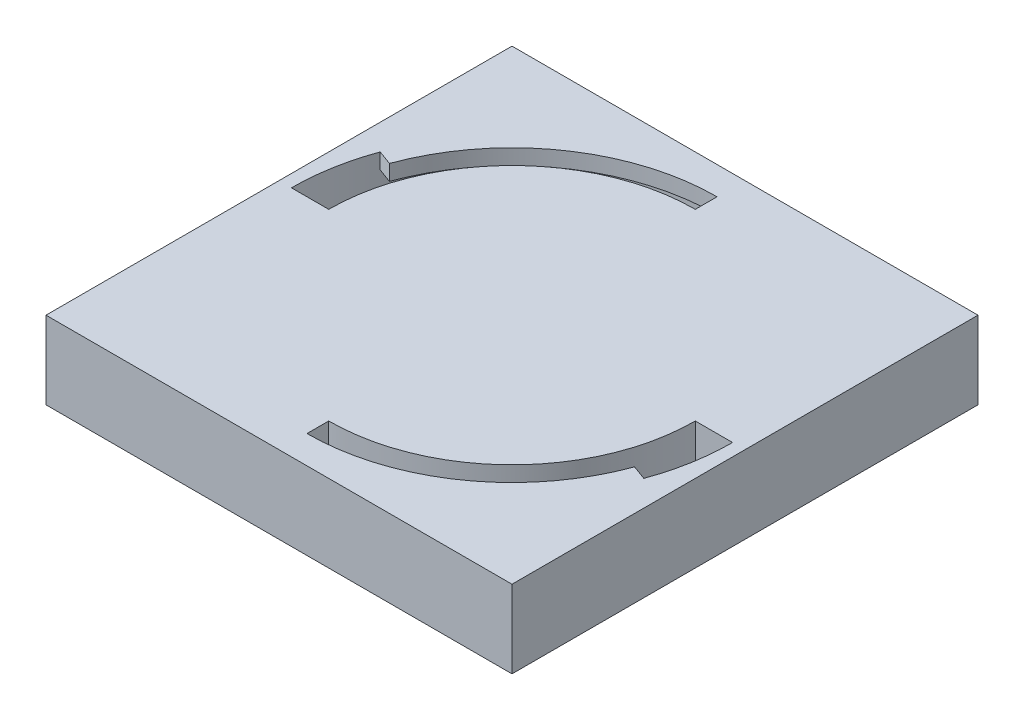
ISO-10303-21;
HEADER;
FILE_DESCRIPTION(('STEP AP214'),'2;1');
FILE_NAME('part.step','',(''),(''),'','','');
FILE_SCHEMA(('AUTOMOTIVE_DESIGN { 1 0 10303 214 1 1 1 1 }'));
ENDSEC;
DATA;
#1=APPLICATION_CONTEXT('core data for automotive mechanical design processes');
#2=APPLICATION_PROTOCOL_DEFINITION('international standard','automotive_design',2000,#1);
#3=PRODUCT_CONTEXT('',#1,'mechanical');
#4=PRODUCT('Part','Part','',(#3));
#5=PRODUCT_RELATED_PRODUCT_CATEGORY('part','',(#4));
#6=PRODUCT_DEFINITION_FORMATION('','',#4);
#7=PRODUCT_DEFINITION_CONTEXT('part definition',#1,'design');
#8=PRODUCT_DEFINITION('design','',#6,#7);
#9=PRODUCT_DEFINITION_SHAPE('','',#8);
#10=(LENGTH_UNIT() NAMED_UNIT(*) SI_UNIT(.MILLI.,.METRE.));
#11=(NAMED_UNIT(*) PLANE_ANGLE_UNIT() SI_UNIT($,.RADIAN.));
#12=(NAMED_UNIT(*) SI_UNIT($,.STERADIAN.) SOLID_ANGLE_UNIT());
#13=UNCERTAINTY_MEASURE_WITH_UNIT(LENGTH_MEASURE(1.E-05),#10,'distance_accuracy_value','');
#14=(GEOMETRIC_REPRESENTATION_CONTEXT(3) GLOBAL_UNCERTAINTY_ASSIGNED_CONTEXT((#13)) GLOBAL_UNIT_ASSIGNED_CONTEXT((#10,
#11,#12)) REPRESENTATION_CONTEXT('',''));
#15=CARTESIAN_POINT('',(0.,0.,0.));
#16=DIRECTION('',(0.,0.,1.));
#17=DIRECTION('',(1.,0.,0.));
#18=AXIS2_PLACEMENT_3D('',#15,#16,#17);
#19=CARTESIAN_POINT('',(0.,5.,0.));
#20=DIRECTION('',(0.,-1.,0.));
#21=DIRECTION('',(0.,0.,-1.));
#22=AXIS2_PLACEMENT_3D('',#19,#20,#21);
#23=PLANE('',#22);
#24=DIRECTION('',(0.,0.,1.));
#25=VECTOR('',#24,1.);
#26=CARTESIAN_POINT('',(0.,5.,0.));
#27=LINE('',#26,#25);
#28=CARTESIAN_POINT('',(0.,5.,-30.));
#29=VERTEX_POINT('',#28);
#30=CARTESIAN_POINT('',(0.,5.,0.));
#31=VERTEX_POINT('',#30);
#32=EDGE_CURVE('E340',#29,#31,#27,.T.);
#33=ORIENTED_EDGE('',*,*,#32,.T.);
#34=DIRECTION('',(1.,0.,0.));
#35=VECTOR('',#34,1.);
#36=CARTESIAN_POINT('',(0.,5.,0.));
#37=LINE('',#36,#35);
#38=CARTESIAN_POINT('',(30.,5.,0.));
#39=VERTEX_POINT('',#38);
#40=EDGE_CURVE('E88',#31,#39,#37,.T.);
#41=ORIENTED_EDGE('',*,*,#40,.T.);
#42=DIRECTION('',(0.,0.,-1.));
#43=VECTOR('',#42,1.);
#44=CARTESIAN_POINT('',(30.,5.,0.));
#45=LINE('',#44,#43);
#46=CARTESIAN_POINT('',(30.,5.,-30.));
#47=VERTEX_POINT('',#46);
#48=EDGE_CURVE('E345',#39,#47,#45,.T.);
#49=ORIENTED_EDGE('',*,*,#48,.T.);
#50=DIRECTION('',(-1.,0.,0.));
#51=VECTOR('',#50,1.);
#52=CARTESIAN_POINT('',(0.,5.,-30.));
#53=LINE('',#52,#51);
#54=EDGE_CURVE('E57',#47,#29,#53,.T.);
#55=ORIENTED_EDGE('',*,*,#54,.T.);
#56=EDGE_LOOP('',(#33,#41,#49,#55));
#57=FACE_BOUND('',#56,.T.);
#58=CARTESIAN_POINT('',(15.,5.,-15.));
#59=DIRECTION('',(0.,1.,0.));
#60=DIRECTION('',(0.,0.,1.));
#61=AXIS2_PLACEMENT_3D('',#58,#59,#60);
#62=CIRCLE('',#61,14.2);
#63=CARTESIAN_POINT('',(28.3436352151599,5.,-10.1433139647755));
#64=VERTEX_POINT('',#63);
#65=CARTESIAN_POINT('',(29.2,5.,-15.));
#66=VERTEX_POINT('',#65);
#67=EDGE_CURVE('E220',#64,#66,#62,.T.);
#68=ORIENTED_EDGE('',*,*,#67,.F.);
#69=DIRECTION('',(0.939692620785908,0.,0.342020143325669));
#70=VECTOR('',#69,1.);
#71=CARTESIAN_POINT('',(0.904610688211379,5.,-20.130302149885));
#72=LINE('',#71,#70);
#73=CARTESIAN_POINT('',(27.403942594374,5.,-10.4853341081012));
#74=VERTEX_POINT('',#73);
#75=EDGE_CURVE('E216',#74,#64,#72,.T.);
#76=ORIENTED_EDGE('',*,*,#75,.F.);
#77=CARTESIAN_POINT('',(15.,5.,-15.));
#78=DIRECTION('',(0.,1.,0.));
#79=DIRECTION('',(0.,0.,1.));
#80=AXIS2_PLACEMENT_3D('',#77,#78,#79);
#81=CIRCLE('',#80,13.2);
#82=CARTESIAN_POINT('',(15.,5.,-1.8));
#83=VERTEX_POINT('',#82);
#84=EDGE_CURVE('E278',#83,#74,#81,.T.);
#85=ORIENTED_EDGE('',*,*,#84,.F.);
#86=DIRECTION('',(0.,0.,1.));
#87=VECTOR('',#86,1.);
#88=CARTESIAN_POINT('',(15.0000000000001,5.,-30.));
#89=LINE('',#88,#87);
#90=CARTESIAN_POINT('',(15.,5.,-3.2));
#91=VERTEX_POINT('',#90);
#92=EDGE_CURVE('E264',#91,#83,#89,.T.);
#93=ORIENTED_EDGE('',*,*,#92,.F.);
#94=CARTESIAN_POINT('',(15.,5.,-15.));
#95=DIRECTION('',(0.,1.,0.));
#96=DIRECTION('',(0.,0.,1.));
#97=AXIS2_PLACEMENT_3D('',#94,#95,#96);
#98=CIRCLE('',#97,11.8);
#99=CARTESIAN_POINT('',(26.8,5.,-15.));
#100=VERTEX_POINT('',#99);
#101=EDGE_CURVE('E275',#91,#100,#98,.T.);
#102=ORIENTED_EDGE('',*,*,#101,.T.);
#103=DIRECTION('',(1.,0.,0.));
#104=VECTOR('',#103,1.);
#105=CARTESIAN_POINT('',(0.,5.,-15.));
#106=LINE('',#105,#104);
#107=EDGE_CURVE('E240',#100,#66,#106,.T.);
#108=ORIENTED_EDGE('',*,*,#107,.T.);
#109=EDGE_LOOP('',(#68,#76,#85,#93,#102,#108));
#110=FACE_BOUND('',#109,.T.);
#111=DIRECTION('',(-0.939692620785908,0.,-0.342020143325669));
#112=VECTOR('',#111,1.);
#113=CARTESIAN_POINT('',(0.904610688211377,5.,-20.130302149885));
#114=LINE('',#113,#112);
#115=CARTESIAN_POINT('',(2.59605740562601,5.,-19.5146658918988));
#116=VERTEX_POINT('',#115);
#117=CARTESIAN_POINT('',(1.65636478484011,5.,-19.8566860352245));
#118=VERTEX_POINT('',#117);
#119=EDGE_CURVE('E203',#116,#118,#114,.T.);
#120=ORIENTED_EDGE('',*,*,#119,.F.);
#121=CARTESIAN_POINT('',(15.,5.,-15.));
#122=DIRECTION('',(0.,1.,0.));
#123=DIRECTION('',(0.,0.,1.));
#124=AXIS2_PLACEMENT_3D('',#121,#122,#123);
#125=CIRCLE('',#124,13.2);
#126=CARTESIAN_POINT('',(15.,5.,-28.2));
#127=VERTEX_POINT('',#126);
#128=EDGE_CURVE('E333',#127,#116,#125,.T.);
#129=ORIENTED_EDGE('',*,*,#128,.F.);
#130=DIRECTION('',(0.,0.,-1.));
#131=VECTOR('',#130,1.);
#132=CARTESIAN_POINT('',(15.0000000000001,5.,-30.));
#133=LINE('',#132,#131);
#134=CARTESIAN_POINT('',(15.,5.,-26.8));
#135=VERTEX_POINT('',#134);
#136=EDGE_CURVE('E301',#135,#127,#133,.T.);
#137=ORIENTED_EDGE('',*,*,#136,.F.);
#138=CARTESIAN_POINT('',(15.,5.,-15.));
#139=DIRECTION('',(0.,1.,0.));
#140=DIRECTION('',(0.,0.,1.));
#141=AXIS2_PLACEMENT_3D('',#138,#139,#140);
#142=CIRCLE('',#141,11.8);
#143=CARTESIAN_POINT('',(3.2,5.,-15.));
#144=VERTEX_POINT('',#143);
#145=EDGE_CURVE('E192',#135,#144,#142,.T.);
#146=ORIENTED_EDGE('',*,*,#145,.T.);
#147=DIRECTION('',(-1.,0.,0.));
#148=VECTOR('',#147,1.);
#149=CARTESIAN_POINT('',(0.,5.,-15.));
#150=LINE('',#149,#148);
#151=CARTESIAN_POINT('',(0.8,5.,-15.));
#152=VERTEX_POINT('',#151);
#153=EDGE_CURVE('E180',#144,#152,#150,.T.);
#154=ORIENTED_EDGE('',*,*,#153,.T.);
#155=CARTESIAN_POINT('',(15.,5.,-15.));
#156=DIRECTION('',(0.,1.,0.));
#157=DIRECTION('',(0.,0.,1.));
#158=AXIS2_PLACEMENT_3D('',#155,#156,#157);
#159=CIRCLE('',#158,14.2);
#160=EDGE_CURVE('E190',#118,#152,#159,.T.);
#161=ORIENTED_EDGE('',*,*,#160,.F.);
#162=EDGE_LOOP('',(#120,#129,#137,#146,#154,#161));
#163=FACE_BOUND('',#162,.T.);
#164=ADVANCED_FACE('F39',(#57,#110,#163),#23,.F.);
#165=CARTESIAN_POINT('',(15.,5.,-15.));
#166=DIRECTION('',(0.,1.,0.));
#167=DIRECTION('',(0.,0.,1.));
#168=AXIS2_PLACEMENT_3D('',#165,#166,#167);
#169=CYLINDRICAL_SURFACE('',#168,13.2);
#170=DIRECTION('',(0.,1.,0.));
#171=VECTOR('',#170,1.);
#172=CARTESIAN_POINT('',(2.59605740562601,5.,-19.5146658918988));
#173=LINE('',#172,#171);
#174=CARTESIAN_POINT('',(2.59605740562601,4.,-19.5146658918988));
#175=VERTEX_POINT('',#174);
#176=EDGE_CURVE('E230',#175,#116,#173,.T.);
#177=ORIENTED_EDGE('',*,*,#176,.F.);
#178=CARTESIAN_POINT('',(15.,4.,-15.));
#179=DIRECTION('',(0.,1.,0.));
#180=DIRECTION('',(0.,0.,1.));
#181=AXIS2_PLACEMENT_3D('',#178,#179,#180);
#182=CIRCLE('',#181,13.2);
#183=CARTESIAN_POINT('',(15.,4.,-28.2));
#184=VERTEX_POINT('',#183);
#185=EDGE_CURVE('E329',#184,#175,#182,.T.);
#186=ORIENTED_EDGE('',*,*,#185,.F.);
#187=DIRECTION('',(0.,-1.,0.));
#188=VECTOR('',#187,1.);
#189=CARTESIAN_POINT('',(15.,0.,-28.2));
#190=LINE('',#189,#188);
#191=EDGE_CURVE('E304',#127,#184,#190,.T.);
#192=ORIENTED_EDGE('',*,*,#191,.F.);
#193=ORIENTED_EDGE('',*,*,#128,.T.);
#194=EDGE_LOOP('',(#177,#186,#192,#193));
#195=FACE_BOUND('',#194,.T.);
#196=ADVANCED_FACE('F386',(#195),#169,.F.);
#197=CARTESIAN_POINT('',(15.0000000000001,4.,-30.));
#198=DIRECTION('',(0.,1.,0.));
#199=DIRECTION('',(0.,0.,1.));
#200=AXIS2_PLACEMENT_3D('',#197,#198,#199);
#201=PLANE('',#200);
#202=DIRECTION('',(0.939692620785908,0.,0.342020143325669));
#203=VECTOR('',#202,1.);
#204=CARTESIAN_POINT('',(10.179092927351,4.,-16.7546666766077));
#205=LINE('',#204,#203);
#206=CARTESIAN_POINT('',(1.65636478484011,4.,-19.8566860352245));
#207=VERTEX_POINT('',#206);
#208=EDGE_CURVE('E227',#207,#175,#205,.T.);
#209=ORIENTED_EDGE('',*,*,#208,.F.);
#210=CARTESIAN_POINT('',(15.,4.,-15.));
#211=DIRECTION('',(0.,1.,0.));
#212=DIRECTION('',(0.,0.,1.));
#213=AXIS2_PLACEMENT_3D('',#210,#211,#212);
#214=CIRCLE('',#213,14.2);
#215=CARTESIAN_POINT('',(15.,4.,-29.2));
#216=VERTEX_POINT('',#215);
#217=EDGE_CURVE('E326',#216,#207,#214,.T.);
#218=ORIENTED_EDGE('',*,*,#217,.F.);
#219=DIRECTION('',(0.,0.,-1.));
#220=VECTOR('',#219,1.);
#221=CARTESIAN_POINT('',(15.0000000000001,4.,-30.));
#222=LINE('',#221,#220);
#223=EDGE_CURVE('E308',#184,#216,#222,.T.);
#224=ORIENTED_EDGE('',*,*,#223,.F.);
#225=ORIENTED_EDGE('',*,*,#185,.T.);
#226=EDGE_LOOP('',(#209,#218,#224,#225));
#227=FACE_BOUND('',#226,.T.);
#228=ADVANCED_FACE('F391',(#227),#201,.F.);
#229=CARTESIAN_POINT('',(0.,5.,0.));
#230=DIRECTION('',(1.,0.,0.));
#231=DIRECTION('',(0.,0.,-1.));
#232=AXIS2_PLACEMENT_3D('',#229,#230,#231);
#233=PLANE('',#232);
#234=DIRECTION('',(0.,0.,1.));
#235=VECTOR('',#234,1.);
#236=CARTESIAN_POINT('',(0.,0.,0.));
#237=LINE('',#236,#235);
#238=CARTESIAN_POINT('',(0.,0.,-30.));
#239=VERTEX_POINT('',#238);
#240=CARTESIAN_POINT('',(0.,0.,0.));
#241=VERTEX_POINT('',#240);
#242=EDGE_CURVE('E339',#239,#241,#237,.T.);
#243=ORIENTED_EDGE('',*,*,#242,.T.);
#244=DIRECTION('',(0.,-1.,0.));
#245=VECTOR('',#244,1.);
#246=CARTESIAN_POINT('',(0.,5.,0.));
#247=LINE('',#246,#245);
#248=EDGE_CURVE('E11',#31,#241,#247,.T.);
#249=ORIENTED_EDGE('',*,*,#248,.F.);
#250=ORIENTED_EDGE('',*,*,#32,.F.);
#251=DIRECTION('',(0.,-1.,0.));
#252=VECTOR('',#251,1.);
#253=CARTESIAN_POINT('',(0.,5.,-30.));
#254=LINE('',#253,#252);
#255=EDGE_CURVE('E350',#29,#239,#254,.T.);
#256=ORIENTED_EDGE('',*,*,#255,.T.);
#257=EDGE_LOOP('',(#243,#249,#250,#256));
#258=FACE_BOUND('',#257,.T.);
#259=ADVANCED_FACE('F41',(#258),#233,.F.);
#260=CARTESIAN_POINT('',(0.,5.,0.));
#261=DIRECTION('',(0.,0.,-1.));
#262=DIRECTION('',(-1.,0.,0.));
#263=AXIS2_PLACEMENT_3D('',#260,#261,#262);
#264=PLANE('',#263);
#265=DIRECTION('',(1.,0.,0.));
#266=VECTOR('',#265,1.);
#267=CARTESIAN_POINT('',(0.,0.,0.));
#268=LINE('',#267,#266);
#269=CARTESIAN_POINT('',(30.,0.,0.));
#270=VERTEX_POINT('',#269);
#271=EDGE_CURVE('E354',#241,#270,#268,.T.);
#272=ORIENTED_EDGE('',*,*,#271,.T.);
#273=DIRECTION('',(0.,-1.,0.));
#274=VECTOR('',#273,1.);
#275=CARTESIAN_POINT('',(30.,5.,0.));
#276=LINE('',#275,#274);
#277=EDGE_CURVE('E49',#39,#270,#276,.T.);
#278=ORIENTED_EDGE('',*,*,#277,.F.);
#279=ORIENTED_EDGE('',*,*,#40,.F.);
#280=ORIENTED_EDGE('',*,*,#248,.T.);
#281=EDGE_LOOP('',(#272,#278,#279,#280));
#282=FACE_BOUND('',#281,.T.);
#283=ADVANCED_FACE('F383',(#282),#264,.F.);
#284=CARTESIAN_POINT('',(30.,5.,0.));
#285=DIRECTION('',(-1.,0.,0.));
#286=DIRECTION('',(0.,0.,1.));
#287=AXIS2_PLACEMENT_3D('',#284,#285,#286);
#288=PLANE('',#287);
#289=DIRECTION('',(0.,0.,-1.));
#290=VECTOR('',#289,1.);
#291=CARTESIAN_POINT('',(30.,0.,0.));
#292=LINE('',#291,#290);
#293=CARTESIAN_POINT('',(30.,0.,-30.));
#294=VERTEX_POINT('',#293);
#295=EDGE_CURVE('E75',#270,#294,#292,.T.);
#296=ORIENTED_EDGE('',*,*,#295,.T.);
#297=DIRECTION('',(0.,-1.,0.));
#298=VECTOR('',#297,1.);
#299=CARTESIAN_POINT('',(30.,5.,-30.));
#300=LINE('',#299,#298);
#301=EDGE_CURVE('E363',#47,#294,#300,.T.);
#302=ORIENTED_EDGE('',*,*,#301,.F.);
#303=ORIENTED_EDGE('',*,*,#48,.F.);
#304=ORIENTED_EDGE('',*,*,#277,.T.);
#305=EDGE_LOOP('',(#296,#302,#303,#304));
#306=FACE_BOUND('',#305,.T.);
#307=ADVANCED_FACE('F367',(#306),#288,.F.);
#308=CARTESIAN_POINT('',(0.,5.,-30.));
#309=DIRECTION('',(0.,0.,1.));
#310=DIRECTION('',(1.,0.,0.));
#311=AXIS2_PLACEMENT_3D('',#308,#309,#310);
#312=PLANE('',#311);
#313=DIRECTION('',(-1.,0.,0.));
#314=VECTOR('',#313,1.);
#315=CARTESIAN_POINT('',(0.,0.,-30.));
#316=LINE('',#315,#314);
#317=EDGE_CURVE('E81',#294,#239,#316,.T.);
#318=ORIENTED_EDGE('',*,*,#317,.T.);
#319=ORIENTED_EDGE('',*,*,#255,.F.);
#320=ORIENTED_EDGE('',*,*,#54,.F.);
#321=ORIENTED_EDGE('',*,*,#301,.T.);
#322=EDGE_LOOP('',(#318,#319,#320,#321));
#323=FACE_BOUND('',#322,.T.);
#324=ADVANCED_FACE('F374',(#323),#312,.F.);
#325=CARTESIAN_POINT('',(0.,0.,0.));
#326=DIRECTION('',(0.,-1.,0.));
#327=DIRECTION('',(0.,0.,-1.));
#328=AXIS2_PLACEMENT_3D('',#325,#326,#327);
#329=PLANE('',#328);
#330=ORIENTED_EDGE('',*,*,#242,.F.);
#331=ORIENTED_EDGE('',*,*,#317,.F.);
#332=ORIENTED_EDGE('',*,*,#295,.F.);
#333=ORIENTED_EDGE('',*,*,#271,.F.);
#334=EDGE_LOOP('',(#330,#331,#332,#333));
#335=FACE_BOUND('',#334,.T.);
#336=ADVANCED_FACE('F370',(#335),#329,.T.);
#337=CARTESIAN_POINT('',(15.,5.,-15.));
#338=DIRECTION('',(0.,1.,0.));
#339=DIRECTION('',(0.,0.,1.));
#340=AXIS2_PLACEMENT_3D('',#337,#338,#339);
#341=CYLINDRICAL_SURFACE('',#340,11.8);
#342=DIRECTION('',(0.,-1.,0.));
#343=VECTOR('',#342,1.);
#344=CARTESIAN_POINT('',(3.2,0.,-15.));
#345=LINE('',#344,#343);
#346=CARTESIAN_POINT('',(3.2,2.,-15.));
#347=VERTEX_POINT('',#346);
#348=EDGE_CURVE('E195',#144,#347,#345,.T.);
#349=ORIENTED_EDGE('',*,*,#348,.F.);
#350=ORIENTED_EDGE('',*,*,#145,.F.);
#351=DIRECTION('',(0.,-1.,0.));
#352=VECTOR('',#351,1.);
#353=CARTESIAN_POINT('',(15.,0.,-26.8));
#354=LINE('',#353,#352);
#355=CARTESIAN_POINT('',(15.,2.,-26.8));
#356=VERTEX_POINT('',#355);
#357=EDGE_CURVE('E297',#135,#356,#354,.T.);
#358=ORIENTED_EDGE('',*,*,#357,.T.);
#359=CARTESIAN_POINT('',(15.,2.,-15.));
#360=DIRECTION('',(0.,1.,0.));
#361=DIRECTION('',(0.,0.,1.));
#362=AXIS2_PLACEMENT_3D('',#359,#360,#361);
#363=CIRCLE('',#362,11.8);
#364=EDGE_CURVE('E320',#356,#347,#363,.T.);
#365=ORIENTED_EDGE('',*,*,#364,.T.);
#366=EDGE_LOOP('',(#349,#350,#358,#365));
#367=FACE_BOUND('',#366,.T.);
#368=ADVANCED_FACE('F381',(#367),#341,.T.);
#369=CARTESIAN_POINT('',(15.,5.,-15.));
#370=DIRECTION('',(0.,1.,0.));
#371=DIRECTION('',(0.,0.,1.));
#372=AXIS2_PLACEMENT_3D('',#369,#370,#371);
#373=CYLINDRICAL_SURFACE('',#372,14.2);
#374=DIRECTION('',(0.,-1.,0.));
#375=VECTOR('',#374,1.);
#376=CARTESIAN_POINT('',(0.800000000000001,0.,-15.));
#377=LINE('',#376,#375);
#378=CARTESIAN_POINT('',(0.8,2.,-15.));
#379=VERTEX_POINT('',#378);
#380=EDGE_CURVE('E176',#152,#379,#377,.T.);
#381=ORIENTED_EDGE('',*,*,#380,.T.);
#382=CARTESIAN_POINT('',(15.,2.,-15.));
#383=DIRECTION('',(0.,1.,0.));
#384=DIRECTION('',(0.,0.,1.));
#385=AXIS2_PLACEMENT_3D('',#382,#383,#384);
#386=CIRCLE('',#385,14.2);
#387=CARTESIAN_POINT('',(15.,2.,-29.2));
#388=VERTEX_POINT('',#387);
#389=EDGE_CURVE('E323',#388,#379,#386,.T.);
#390=ORIENTED_EDGE('',*,*,#389,.F.);
#391=DIRECTION('',(0.,-1.,0.));
#392=VECTOR('',#391,1.);
#393=CARTESIAN_POINT('',(15.,0.,-29.2));
#394=LINE('',#393,#392);
#395=EDGE_CURVE('E312',#216,#388,#394,.T.);
#396=ORIENTED_EDGE('',*,*,#395,.F.);
#397=ORIENTED_EDGE('',*,*,#217,.T.);
#398=DIRECTION('',(0.,1.,0.));
#399=VECTOR('',#398,1.);
#400=CARTESIAN_POINT('',(1.65636478484011,0.,-19.8566860352245));
#401=LINE('',#400,#399);
#402=EDGE_CURVE('E199',#207,#118,#401,.T.);
#403=ORIENTED_EDGE('',*,*,#402,.T.);
#404=ORIENTED_EDGE('',*,*,#160,.T.);
#405=EDGE_LOOP('',(#381,#390,#396,#397,#403,#404));
#406=FACE_BOUND('',#405,.T.);
#407=ADVANCED_FACE('F197',(#406),#373,.F.);
#408=CARTESIAN_POINT('',(15.0000000000001,2.,-30.));
#409=DIRECTION('',(0.,-1.,0.));
#410=DIRECTION('',(0.,0.,-1.));
#411=AXIS2_PLACEMENT_3D('',#408,#409,#410);
#412=PLANE('',#411);
#413=DIRECTION('',(1.,0.,0.));
#414=VECTOR('',#413,1.);
#415=CARTESIAN_POINT('',(0.,2.,-15.));
#416=LINE('',#415,#414);
#417=EDGE_CURVE('E182',#379,#347,#416,.T.);
#418=ORIENTED_EDGE('',*,*,#417,.T.);
#419=ORIENTED_EDGE('',*,*,#364,.F.);
#420=DIRECTION('',(0.,0.,1.));
#421=VECTOR('',#420,1.);
#422=CARTESIAN_POINT('',(15.0000000000001,2.,-30.));
#423=LINE('',#422,#421);
#424=EDGE_CURVE('E316',#388,#356,#423,.T.);
#425=ORIENTED_EDGE('',*,*,#424,.F.);
#426=ORIENTED_EDGE('',*,*,#389,.T.);
#427=EDGE_LOOP('',(#418,#419,#425,#426));
#428=FACE_BOUND('',#427,.T.);
#429=ADVANCED_FACE('F401',(#428),#412,.F.);
#430=CARTESIAN_POINT('',(15.0000000000001,0.,-30.));
#431=DIRECTION('',(-1.,0.,0.));
#432=DIRECTION('',(0.,0.,1.));
#433=AXIS2_PLACEMENT_3D('',#430,#431,#432);
#434=PLANE('',#433);
#435=ORIENTED_EDGE('',*,*,#357,.F.);
#436=ORIENTED_EDGE('',*,*,#136,.T.);
#437=ORIENTED_EDGE('',*,*,#191,.T.);
#438=ORIENTED_EDGE('',*,*,#223,.T.);
#439=ORIENTED_EDGE('',*,*,#395,.T.);
#440=ORIENTED_EDGE('',*,*,#424,.T.);
#441=EDGE_LOOP('',(#435,#436,#437,#438,#439,#440));
#442=FACE_BOUND('',#441,.T.);
#443=ADVANCED_FACE('F404',(#442),#434,.T.);
#444=CARTESIAN_POINT('',(0.,0.,-15.));
#445=DIRECTION('',(0.,0.,1.));
#446=DIRECTION('',(1.,0.,0.));
#447=AXIS2_PLACEMENT_3D('',#444,#445,#446);
#448=PLANE('',#447);
#449=ORIENTED_EDGE('',*,*,#348,.T.);
#450=ORIENTED_EDGE('',*,*,#417,.F.);
#451=ORIENTED_EDGE('',*,*,#380,.F.);
#452=ORIENTED_EDGE('',*,*,#153,.F.);
#453=EDGE_LOOP('',(#449,#450,#451,#452));
#454=FACE_BOUND('',#453,.T.);
#455=ADVANCED_FACE('F179',(#454),#448,.F.);
#456=CARTESIAN_POINT('',(15.0000000000001,2.,-30.));
#457=DIRECTION('',(0.,-1.,0.));
#458=DIRECTION('',(0.,0.,-1.));
#459=AXIS2_PLACEMENT_3D('',#456,#457,#458);
#460=PLANE('',#459);
#461=CARTESIAN_POINT('',(15.,2.,-15.));
#462=DIRECTION('',(0.,1.,0.));
#463=DIRECTION('',(0.,0.,1.));
#464=AXIS2_PLACEMENT_3D('',#461,#462,#463);
#465=CIRCLE('',#464,14.2);
#466=CARTESIAN_POINT('',(15.,2.,-0.800000000000002));
#467=VERTEX_POINT('',#466);
#468=CARTESIAN_POINT('',(29.2,2.,-15.));
#469=VERTEX_POINT('',#468);
#470=EDGE_CURVE('E290',#467,#469,#465,.T.);
#471=ORIENTED_EDGE('',*,*,#470,.T.);
#472=DIRECTION('',(-1.,0.,0.));
#473=VECTOR('',#472,1.);
#474=CARTESIAN_POINT('',(0.,2.,-15.));
#475=LINE('',#474,#473);
#476=CARTESIAN_POINT('',(26.8,2.,-15.));
#477=VERTEX_POINT('',#476);
#478=EDGE_CURVE('E233',#469,#477,#475,.T.);
#479=ORIENTED_EDGE('',*,*,#478,.T.);
#480=CARTESIAN_POINT('',(15.,2.,-15.));
#481=DIRECTION('',(0.,1.,0.));
#482=DIRECTION('',(0.,0.,1.));
#483=AXIS2_PLACEMENT_3D('',#480,#481,#482);
#484=CIRCLE('',#483,11.8);
#485=CARTESIAN_POINT('',(15.,2.,-3.20000000000001));
#486=VERTEX_POINT('',#485);
#487=EDGE_CURVE('E272',#486,#477,#484,.T.);
#488=ORIENTED_EDGE('',*,*,#487,.F.);
#489=DIRECTION('',(0.,0.,-1.));
#490=VECTOR('',#489,1.);
#491=CARTESIAN_POINT('',(15.0000000000001,2.,-30.));
#492=LINE('',#491,#490);
#493=EDGE_CURVE('E248',#467,#486,#492,.T.);
#494=ORIENTED_EDGE('',*,*,#493,.F.);
#495=EDGE_LOOP('',(#471,#479,#488,#494));
#496=FACE_BOUND('',#495,.T.);
#497=ADVANCED_FACE('F414',(#496),#460,.F.);
#498=CARTESIAN_POINT('',(15.,5.,-15.));
#499=DIRECTION('',(0.,1.,0.));
#500=DIRECTION('',(0.,0.,1.));
#501=AXIS2_PLACEMENT_3D('',#498,#499,#500);
#502=CYLINDRICAL_SURFACE('',#501,14.2);
#503=CARTESIAN_POINT('',(15.,4.00000000000001,-15.));
#504=DIRECTION('',(0.,1.,0.));
#505=DIRECTION('',(0.,0.,1.));
#506=AXIS2_PLACEMENT_3D('',#503,#504,#505);
#507=CIRCLE('',#506,14.2);
#508=CARTESIAN_POINT('',(15.,4.00000000000001,-0.800000000000002));
#509=VERTEX_POINT('',#508);
#510=CARTESIAN_POINT('',(28.3436352151599,4.00000000000001,-10.1433139647755));
#511=VERTEX_POINT('',#510);
#512=EDGE_CURVE('E286',#509,#511,#507,.T.);
#513=ORIENTED_EDGE('',*,*,#512,.T.);
#514=DIRECTION('',(0.,1.,0.));
#515=VECTOR('',#514,1.);
#516=CARTESIAN_POINT('',(28.3436352151599,0.,-10.1433139647755));
#517=LINE('',#516,#515);
#518=EDGE_CURVE('E213',#511,#64,#517,.T.);
#519=ORIENTED_EDGE('',*,*,#518,.T.);
#520=ORIENTED_EDGE('',*,*,#67,.T.);
#521=DIRECTION('',(0.,1.,0.));
#522=VECTOR('',#521,1.);
#523=CARTESIAN_POINT('',(29.2,0.,-15.));
#524=LINE('',#523,#522);
#525=EDGE_CURVE('E237',#469,#66,#524,.T.);
#526=ORIENTED_EDGE('',*,*,#525,.F.);
#527=ORIENTED_EDGE('',*,*,#470,.F.);
#528=DIRECTION('',(0.,1.,0.));
#529=VECTOR('',#528,1.);
#530=CARTESIAN_POINT('',(15.,0.,-0.800000000000002));
#531=LINE('',#530,#529);
#532=EDGE_CURVE('E252',#467,#509,#531,.T.);
#533=ORIENTED_EDGE('',*,*,#532,.T.);
#534=EDGE_LOOP('',(#513,#519,#520,#526,#527,#533));
#535=FACE_BOUND('',#534,.T.);
#536=ADVANCED_FACE('F415',(#535),#502,.F.);
#537=CARTESIAN_POINT('',(15.0000000000001,4.00000000000001,-30.));
#538=DIRECTION('',(0.,1.,0.));
#539=DIRECTION('',(0.,0.,1.));
#540=AXIS2_PLACEMENT_3D('',#537,#538,#539);
#541=PLANE('',#540);
#542=CARTESIAN_POINT('',(15.,4.00000000000001,-15.));
#543=DIRECTION('',(0.,1.,0.));
#544=DIRECTION('',(0.,0.,1.));
#545=AXIS2_PLACEMENT_3D('',#542,#543,#544);
#546=CIRCLE('',#545,13.2);
#547=CARTESIAN_POINT('',(15.,4.00000000000001,-1.8));
#548=VERTEX_POINT('',#547);
#549=CARTESIAN_POINT('',(27.403942594374,4.00000000000001,-10.4853341081012));
#550=VERTEX_POINT('',#549);
#551=EDGE_CURVE('E282',#548,#550,#546,.T.);
#552=ORIENTED_EDGE('',*,*,#551,.T.);
#553=DIRECTION('',(0.939692620785908,0.,0.342020143325669));
#554=VECTOR('',#553,1.);
#555=CARTESIAN_POINT('',(10.179092927351,4.00000000000001,-16.7546666766077));
#556=LINE('',#555,#554);
#557=EDGE_CURVE('E208',#550,#511,#556,.T.);
#558=ORIENTED_EDGE('',*,*,#557,.T.);
#559=ORIENTED_EDGE('',*,*,#512,.F.);
#560=DIRECTION('',(0.,0.,1.));
#561=VECTOR('',#560,1.);
#562=CARTESIAN_POINT('',(15.0000000000001,4.00000000000001,-30.));
#563=LINE('',#562,#561);
#564=EDGE_CURVE('E256',#548,#509,#563,.T.);
#565=ORIENTED_EDGE('',*,*,#564,.F.);
#566=EDGE_LOOP('',(#552,#558,#559,#565));
#567=FACE_BOUND('',#566,.T.);
#568=ADVANCED_FACE('F418',(#567),#541,.F.);
#569=CARTESIAN_POINT('',(15.,5.,-15.));
#570=DIRECTION('',(0.,1.,0.));
#571=DIRECTION('',(0.,0.,1.));
#572=AXIS2_PLACEMENT_3D('',#569,#570,#571);
#573=CYLINDRICAL_SURFACE('',#572,13.2);
#574=ORIENTED_EDGE('',*,*,#84,.T.);
#575=DIRECTION('',(0.,1.,0.));
#576=VECTOR('',#575,1.);
#577=CARTESIAN_POINT('',(27.403942594374,5.,-10.4853341081012));
#578=LINE('',#577,#576);
#579=EDGE_CURVE('E202',#74,#550,#578,.F.);
#580=ORIENTED_EDGE('',*,*,#579,.T.);
#581=ORIENTED_EDGE('',*,*,#551,.F.);
#582=DIRECTION('',(0.,-1.,0.));
#583=VECTOR('',#582,1.);
#584=CARTESIAN_POINT('',(15.,0.,-1.8));
#585=LINE('',#584,#583);
#586=EDGE_CURVE('E260',#83,#548,#585,.T.);
#587=ORIENTED_EDGE('',*,*,#586,.F.);
#588=EDGE_LOOP('',(#574,#580,#581,#587));
#589=FACE_BOUND('',#588,.T.);
#590=ADVANCED_FACE('F422',(#589),#573,.F.);
#591=CARTESIAN_POINT('',(15.,5.,-15.));
#592=DIRECTION('',(0.,1.,0.));
#593=DIRECTION('',(0.,0.,1.));
#594=AXIS2_PLACEMENT_3D('',#591,#592,#593);
#595=CYLINDRICAL_SURFACE('',#594,11.8);
#596=ORIENTED_EDGE('',*,*,#487,.T.);
#597=DIRECTION('',(0.,-1.,0.));
#598=VECTOR('',#597,1.);
#599=CARTESIAN_POINT('',(26.8,0.,-15.));
#600=LINE('',#599,#598);
#601=EDGE_CURVE('E244',#100,#477,#600,.T.);
#602=ORIENTED_EDGE('',*,*,#601,.F.);
#603=ORIENTED_EDGE('',*,*,#101,.F.);
#604=DIRECTION('',(0.,-1.,0.));
#605=VECTOR('',#604,1.);
#606=CARTESIAN_POINT('',(15.,0.,-3.20000000000001));
#607=LINE('',#606,#605);
#608=EDGE_CURVE('E268',#91,#486,#607,.T.);
#609=ORIENTED_EDGE('',*,*,#608,.T.);
#610=EDGE_LOOP('',(#596,#602,#603,#609));
#611=FACE_BOUND('',#610,.T.);
#612=ADVANCED_FACE('F426',(#611),#595,.T.);
#613=CARTESIAN_POINT('',(15.0000000000001,0.,-30.));
#614=DIRECTION('',(-1.,0.,0.));
#615=DIRECTION('',(0.,0.,1.));
#616=AXIS2_PLACEMENT_3D('',#613,#614,#615);
#617=PLANE('',#616);
#618=ORIENTED_EDGE('',*,*,#493,.T.);
#619=ORIENTED_EDGE('',*,*,#608,.F.);
#620=ORIENTED_EDGE('',*,*,#92,.T.);
#621=ORIENTED_EDGE('',*,*,#586,.T.);
#622=ORIENTED_EDGE('',*,*,#564,.T.);
#623=ORIENTED_EDGE('',*,*,#532,.F.);
#624=EDGE_LOOP('',(#618,#619,#620,#621,#622,#623));
#625=FACE_BOUND('',#624,.T.);
#626=ADVANCED_FACE('F430',(#625),#617,.F.);
#627=CARTESIAN_POINT('',(0.,0.,-15.));
#628=DIRECTION('',(0.,0.,1.));
#629=DIRECTION('',(1.,0.,0.));
#630=AXIS2_PLACEMENT_3D('',#627,#628,#629);
#631=PLANE('',#630);
#632=ORIENTED_EDGE('',*,*,#525,.T.);
#633=ORIENTED_EDGE('',*,*,#107,.F.);
#634=ORIENTED_EDGE('',*,*,#601,.T.);
#635=ORIENTED_EDGE('',*,*,#478,.F.);
#636=EDGE_LOOP('',(#632,#633,#634,#635));
#637=FACE_BOUND('',#636,.T.);
#638=ADVANCED_FACE('F437',(#637),#631,.T.);
#639=CARTESIAN_POINT('',(0.904610688211379,0.,-20.130302149885));
#640=DIRECTION('',(-0.342020143325669,0.,0.939692620785908));
#641=DIRECTION('',(0.939692620785908,0.,0.342020143325669));
#642=AXIS2_PLACEMENT_3D('',#639,#640,#641);
#643=PLANE('',#642);
#644=ORIENTED_EDGE('',*,*,#579,.F.);
#645=ORIENTED_EDGE('',*,*,#75,.T.);
#646=ORIENTED_EDGE('',*,*,#518,.F.);
#647=ORIENTED_EDGE('',*,*,#557,.F.);
#648=EDGE_LOOP('',(#644,#645,#646,#647));
#649=FACE_BOUND('',#648,.T.);
#650=ADVANCED_FACE('F441',(#649),#643,.F.);
#651=CARTESIAN_POINT('',(0.904610688211379,0.,-20.130302149885));
#652=DIRECTION('',(-0.342020143325669,0.,0.939692620785908));
#653=DIRECTION('',(0.939692620785908,0.,0.342020143325669));
#654=AXIS2_PLACEMENT_3D('',#651,#652,#653);
#655=PLANE('',#654);
#656=ORIENTED_EDGE('',*,*,#176,.T.);
#657=ORIENTED_EDGE('',*,*,#119,.T.);
#658=ORIENTED_EDGE('',*,*,#402,.F.);
#659=ORIENTED_EDGE('',*,*,#208,.T.);
#660=EDGE_LOOP('',(#656,#657,#658,#659));
#661=FACE_BOUND('',#660,.T.);
#662=ADVANCED_FACE('F445',(#661),#655,.T.);
#663=CLOSED_SHELL('',(#164,#196,#228,#259,#283,#307,#324,#336,#368,#407,#429,#443,#455,#497,
#536,#568,#590,#612,#626,#638,#650,#662));
#664=MANIFOLD_SOLID_BREP('B2',#663);
#665=ADVANCED_BREP_SHAPE_REPRESENTATION('',(#18,#664),#14);
#666=SHAPE_DEFINITION_REPRESENTATION(#9,#665);
ENDSEC;
END-ISO-10303-21;
